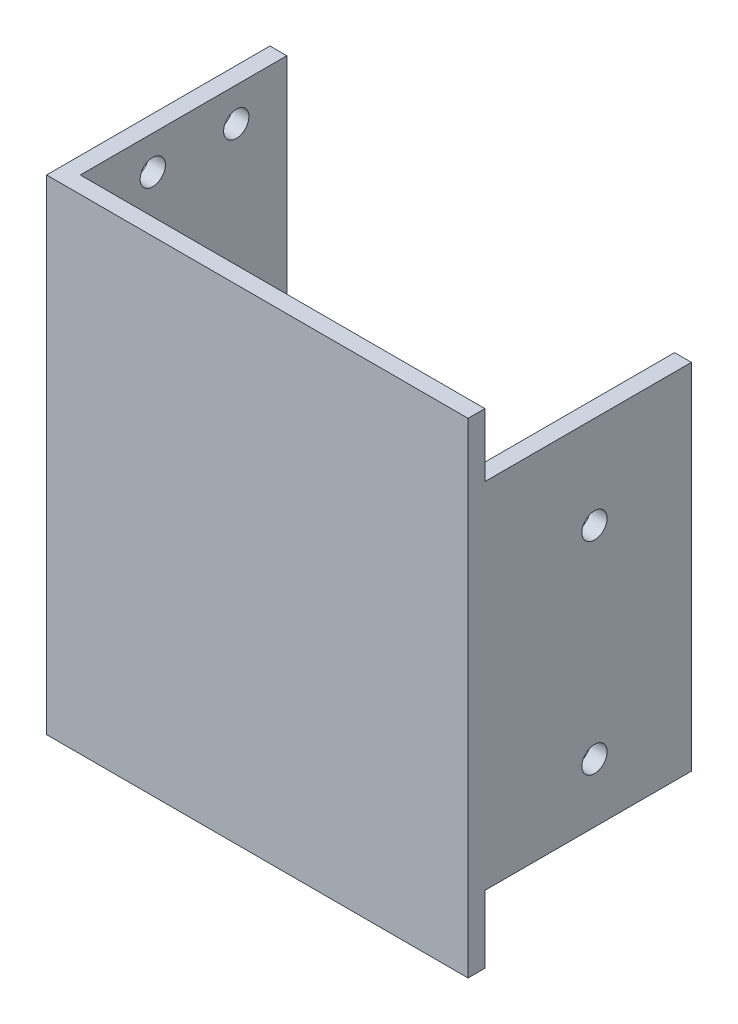
ISO-10303-21;
HEADER;
FILE_DESCRIPTION(('STEP AP214'),'2;1');
FILE_NAME('part.step','',(''),(''),'','','');
FILE_SCHEMA(('AUTOMOTIVE_DESIGN { 1 0 10303 214 1 1 1 1 }'));
ENDSEC;
DATA;
#1=APPLICATION_CONTEXT('core data for automotive mechanical design processes');
#2=APPLICATION_PROTOCOL_DEFINITION('international standard','automotive_design',2000,#1);
#3=PRODUCT_CONTEXT('',#1,'mechanical');
#4=PRODUCT('Part','Part','',(#3));
#5=PRODUCT_RELATED_PRODUCT_CATEGORY('part','',(#4));
#6=PRODUCT_DEFINITION_FORMATION('','',#4);
#7=PRODUCT_DEFINITION_CONTEXT('part definition',#1,'design');
#8=PRODUCT_DEFINITION('design','',#6,#7);
#9=PRODUCT_DEFINITION_SHAPE('','',#8);
#10=(LENGTH_UNIT() NAMED_UNIT(*) SI_UNIT(.MILLI.,.METRE.));
#11=(NAMED_UNIT(*) PLANE_ANGLE_UNIT() SI_UNIT($,.RADIAN.));
#12=(NAMED_UNIT(*) SI_UNIT($,.STERADIAN.) SOLID_ANGLE_UNIT());
#13=UNCERTAINTY_MEASURE_WITH_UNIT(LENGTH_MEASURE(1.E-05),#10,'distance_accuracy_value','');
#14=(GEOMETRIC_REPRESENTATION_CONTEXT(3) GLOBAL_UNCERTAINTY_ASSIGNED_CONTEXT((#13)) GLOBAL_UNIT_ASSIGNED_CONTEXT((#10,
#11,#12)) REPRESENTATION_CONTEXT('',''));
#15=CARTESIAN_POINT('',(0.,0.,0.));
#16=DIRECTION('',(0.,0.,1.));
#17=DIRECTION('',(1.,0.,0.));
#18=AXIS2_PLACEMENT_3D('',#15,#16,#17);
#19=CARTESIAN_POINT('',(0.,0.,-738.5));
#20=DIRECTION('',(0.,0.,-1.));
#21=DIRECTION('',(-1.,0.,0.));
#22=AXIS2_PLACEMENT_3D('',#19,#20,#21);
#23=PLANE('',#22);
#24=DIRECTION('',(0.,1.,0.));
#25=VECTOR('',#24,1.);
#26=CARTESIAN_POINT('',(23.,3.74999999999999,-738.5));
#27=LINE('',#26,#25);
#28=CARTESIAN_POINT('',(23.,-38.25,-738.5));
#29=VERTEX_POINT('',#28);
#30=CARTESIAN_POINT('',(23.,3.74999999999999,-738.5));
#31=VERTEX_POINT('',#30);
#32=EDGE_CURVE('E282',#29,#31,#27,.T.);
#33=ORIENTED_EDGE('',*,*,#32,.F.);
#34=DIRECTION('',(-1.,0.,0.));
#35=VECTOR('',#34,1.);
#36=CARTESIAN_POINT('',(25.,-38.25,-738.5));
#37=LINE('',#36,#35);
#38=CARTESIAN_POINT('',(25.,-38.25,-738.5));
#39=VERTEX_POINT('',#38);
#40=EDGE_CURVE('E234',#39,#29,#37,.T.);
#41=ORIENTED_EDGE('',*,*,#40,.F.);
#42=DIRECTION('',(0.,-1.,0.));
#43=VECTOR('',#42,1.);
#44=CARTESIAN_POINT('',(25.,11.25,-738.5));
#45=LINE('',#44,#43);
#46=CARTESIAN_POINT('',(25.,-46.25,-738.5));
#47=VERTEX_POINT('',#46);
#48=EDGE_CURVE('E153',#39,#47,#45,.T.);
#49=ORIENTED_EDGE('',*,*,#48,.T.);
#50=DIRECTION('',(-1.,0.,0.));
#51=VECTOR('',#50,1.);
#52=CARTESIAN_POINT('',(25.,-46.25,-738.5));
#53=LINE('',#52,#51);
#54=CARTESIAN_POINT('',(-23.,-46.25,-738.5));
#55=VERTEX_POINT('',#54);
#56=EDGE_CURVE('E189',#47,#55,#53,.T.);
#57=ORIENTED_EDGE('',*,*,#56,.T.);
#58=DIRECTION('',(0.,-1.,0.));
#59=VECTOR('',#58,1.);
#60=CARTESIAN_POINT('',(-23.,11.25,-738.5));
#61=LINE('',#60,#59);
#62=CARTESIAN_POINT('',(-23.,11.25,-738.5));
#63=VERTEX_POINT('',#62);
#64=EDGE_CURVE('E73',#63,#55,#61,.T.);
#65=ORIENTED_EDGE('',*,*,#64,.F.);
#66=DIRECTION('',(1.,0.,0.));
#67=VECTOR('',#66,1.);
#68=CARTESIAN_POINT('',(25.,11.25,-738.5));
#69=LINE('',#68,#67);
#70=CARTESIAN_POINT('',(25.,11.25,-738.5));
#71=VERTEX_POINT('',#70);
#72=EDGE_CURVE('E192',#63,#71,#69,.T.);
#73=ORIENTED_EDGE('',*,*,#72,.T.);
#74=CARTESIAN_POINT('',(25.,3.74999999999999,-738.5));
#75=VERTEX_POINT('',#74);
#76=EDGE_CURVE('E185',#71,#75,#45,.T.);
#77=ORIENTED_EDGE('',*,*,#76,.T.);
#78=DIRECTION('',(1.,0.,0.));
#79=VECTOR('',#78,1.);
#80=CARTESIAN_POINT('',(25.,3.74999999999999,-738.5));
#81=LINE('',#80,#79);
#82=EDGE_CURVE('E148',#31,#75,#81,.T.);
#83=ORIENTED_EDGE('',*,*,#82,.F.);
#84=EDGE_LOOP('',(#33,#41,#49,#57,#65,#73,#77,#83));
#85=FACE_BOUND('',#84,.T.);
#86=ADVANCED_FACE('F47',(#85),#23,.T.);
#87=CARTESIAN_POINT('',(25.,11.25,-738.5));
#88=DIRECTION('',(-1.,0.,0.));
#89=DIRECTION('',(0.,-1.,0.));
#90=AXIS2_PLACEMENT_3D('',#87,#88,#89);
#91=PLANE('',#90);
#92=CARTESIAN_POINT('',(25.,-7.25000000000001,-751.5));
#93=DIRECTION('',(1.,0.,0.));
#94=DIRECTION('',(0.,1.,0.));
#95=AXIS2_PLACEMENT_3D('',#92,#93,#94);
#96=CIRCLE('',#95,1.49999999999997);
#97=CARTESIAN_POINT('',(25.,-5.75000000000004,-751.5));
#98=VERTEX_POINT('',#97);
#99=EDGE_CURVE('E243',#98,#98,#96,.T.);
#100=ORIENTED_EDGE('',*,*,#99,.F.);
#101=EDGE_LOOP('',(#100));
#102=FACE_BOUND('',#101,.T.);
#103=CARTESIAN_POINT('',(25.,-31.25,-751.5));
#104=DIRECTION('',(1.,0.,0.));
#105=DIRECTION('',(0.,1.,0.));
#106=AXIS2_PLACEMENT_3D('',#103,#104,#105);
#107=CIRCLE('',#106,1.49999999999997);
#108=CARTESIAN_POINT('',(25.,-29.75,-751.5));
#109=VERTEX_POINT('',#108);
#110=EDGE_CURVE('E250',#109,#109,#107,.T.);
#111=ORIENTED_EDGE('',*,*,#110,.F.);
#112=EDGE_LOOP('',(#111));
#113=FACE_BOUND('',#112,.T.);
#114=DIRECTION('',(0.,-1.,0.));
#115=VECTOR('',#114,1.);
#116=CARTESIAN_POINT('',(25.,11.25,-736.5));
#117=LINE('',#116,#115);
#118=CARTESIAN_POINT('',(25.,11.25,-736.5));
#119=VERTEX_POINT('',#118);
#120=CARTESIAN_POINT('',(25.,-46.25,-736.5));
#121=VERTEX_POINT('',#120);
#122=EDGE_CURVE('E184',#119,#121,#117,.T.);
#123=ORIENTED_EDGE('',*,*,#122,.T.);
#124=DIRECTION('',(0.,0.,1.));
#125=VECTOR('',#124,1.);
#126=CARTESIAN_POINT('',(25.,-46.25,-738.5));
#127=LINE('',#126,#125);
#128=EDGE_CURVE('E11',#47,#121,#127,.T.);
#129=ORIENTED_EDGE('',*,*,#128,.F.);
#130=ORIENTED_EDGE('',*,*,#48,.F.);
#131=DIRECTION('',(0.,0.,1.));
#132=VECTOR('',#131,1.);
#133=CARTESIAN_POINT('',(25.,-38.25,-763.));
#134=LINE('',#133,#132);
#135=CARTESIAN_POINT('',(25.,-38.25,-763.));
#136=VERTEX_POINT('',#135);
#137=EDGE_CURVE('E131',#136,#39,#134,.T.);
#138=ORIENTED_EDGE('',*,*,#137,.F.);
#139=DIRECTION('',(0.,-1.,0.));
#140=VECTOR('',#139,1.);
#141=CARTESIAN_POINT('',(25.,3.74999999999999,-763.));
#142=LINE('',#141,#140);
#143=CARTESIAN_POINT('',(25.,3.74999999999999,-763.));
#144=VERTEX_POINT('',#143);
#145=EDGE_CURVE('E139',#144,#136,#142,.T.);
#146=ORIENTED_EDGE('',*,*,#145,.F.);
#147=DIRECTION('',(0.,0.,1.));
#148=VECTOR('',#147,1.);
#149=CARTESIAN_POINT('',(25.,3.74999999999999,-763.));
#150=LINE('',#149,#148);
#151=EDGE_CURVE('E279',#144,#75,#150,.T.);
#152=ORIENTED_EDGE('',*,*,#151,.T.);
#153=ORIENTED_EDGE('',*,*,#76,.F.);
#154=DIRECTION('',(0.,0.,1.));
#155=VECTOR('',#154,1.);
#156=CARTESIAN_POINT('',(25.,11.25,-738.5));
#157=LINE('',#156,#155);
#158=EDGE_CURVE('E195',#71,#119,#157,.T.);
#159=ORIENTED_EDGE('',*,*,#158,.T.);
#160=EDGE_LOOP('',(#123,#129,#130,#138,#146,#152,#153,#159));
#161=FACE_BOUND('',#160,.T.);
#162=ADVANCED_FACE('F49',(#102,#113,#161),#91,.F.);
#163=CARTESIAN_POINT('',(25.,-46.25,-738.5));
#164=DIRECTION('',(0.,1.,0.));
#165=DIRECTION('',(0.,0.,1.));
#166=AXIS2_PLACEMENT_3D('',#163,#164,#165);
#167=PLANE('',#166);
#168=DIRECTION('',(-1.,0.,0.));
#169=VECTOR('',#168,1.);
#170=CARTESIAN_POINT('',(25.,-46.25,-736.5));
#171=LINE('',#170,#169);
#172=CARTESIAN_POINT('',(-25.,-46.25,-736.5));
#173=VERTEX_POINT('',#172);
#174=EDGE_CURVE('E198',#121,#173,#171,.T.);
#175=ORIENTED_EDGE('',*,*,#174,.T.);
#176=DIRECTION('',(0.,0.,1.));
#177=VECTOR('',#176,1.);
#178=CARTESIAN_POINT('',(-25.,-46.25,-738.5));
#179=LINE('',#178,#177);
#180=CARTESIAN_POINT('',(-25.,-46.25,-763.));
#181=VERTEX_POINT('',#180);
#182=EDGE_CURVE('E57',#181,#173,#179,.T.);
#183=ORIENTED_EDGE('',*,*,#182,.F.);
#184=DIRECTION('',(-1.,0.,0.));
#185=VECTOR('',#184,1.);
#186=CARTESIAN_POINT('',(-25.,-46.25,-763.));
#187=LINE('',#186,#185);
#188=CARTESIAN_POINT('',(-23.,-46.25,-763.));
#189=VERTEX_POINT('',#188);
#190=EDGE_CURVE('E172',#189,#181,#187,.T.);
#191=ORIENTED_EDGE('',*,*,#190,.F.);
#192=DIRECTION('',(0.,0.,1.));
#193=VECTOR('',#192,1.);
#194=CARTESIAN_POINT('',(-23.,-46.25,-763.));
#195=LINE('',#194,#193);
#196=EDGE_CURVE('E175',#189,#55,#195,.T.);
#197=ORIENTED_EDGE('',*,*,#196,.T.);
#198=ORIENTED_EDGE('',*,*,#56,.F.);
#199=ORIENTED_EDGE('',*,*,#128,.T.);
#200=EDGE_LOOP('',(#175,#183,#191,#197,#198,#199));
#201=FACE_BOUND('',#200,.T.);
#202=ADVANCED_FACE('F303',(#201),#167,.F.);
#203=CARTESIAN_POINT('',(-25.,11.25,-738.5));
#204=DIRECTION('',(1.,0.,0.));
#205=DIRECTION('',(0.,1.,0.));
#206=AXIS2_PLACEMENT_3D('',#203,#204,#205);
#207=PLANE('',#206);
#208=CARTESIAN_POINT('',(-25.,-31.25,-752.05));
#209=DIRECTION('',(-1.,0.,0.));
#210=DIRECTION('',(0.,-1.,0.));
#211=AXIS2_PLACEMENT_3D('',#208,#209,#210);
#212=CIRCLE('',#211,1.49999999999997);
#213=CARTESIAN_POINT('',(-25.,-32.75,-752.05));
#214=VERTEX_POINT('',#213);
#215=EDGE_CURVE('E239',#214,#214,#212,.T.);
#216=ORIENTED_EDGE('',*,*,#215,.F.);
#217=EDGE_LOOP('',(#216));
#218=FACE_BOUND('',#217,.T.);
#219=CARTESIAN_POINT('',(-25.,-41.75,-757.));
#220=DIRECTION('',(-1.,0.,0.));
#221=DIRECTION('',(0.,-1.,0.));
#222=AXIS2_PLACEMENT_3D('',#219,#220,#221);
#223=CIRCLE('',#222,1.49999999999997);
#224=CARTESIAN_POINT('',(-25.,-43.25,-757.));
#225=VERTEX_POINT('',#224);
#226=EDGE_CURVE('E238',#225,#225,#223,.T.);
#227=ORIENTED_EDGE('',*,*,#226,.F.);
#228=EDGE_LOOP('',(#227));
#229=FACE_BOUND('',#228,.T.);
#230=CARTESIAN_POINT('',(-25.,-41.75,-747.1));
#231=DIRECTION('',(-1.,0.,0.));
#232=DIRECTION('',(0.,-1.,0.));
#233=AXIS2_PLACEMENT_3D('',#230,#231,#232);
#234=CIRCLE('',#233,1.49999999999997);
#235=CARTESIAN_POINT('',(-25.,-43.25,-747.1));
#236=VERTEX_POINT('',#235);
#237=EDGE_CURVE('E265',#236,#236,#234,.T.);
#238=ORIENTED_EDGE('',*,*,#237,.F.);
#239=EDGE_LOOP('',(#238));
#240=FACE_BOUND('',#239,.T.);
#241=CARTESIAN_POINT('',(-25.,7.25,-747.1));
#242=DIRECTION('',(-1.,0.,0.));
#243=DIRECTION('',(0.,-1.,0.));
#244=AXIS2_PLACEMENT_3D('',#241,#242,#243);
#245=CIRCLE('',#244,1.49999999999997);
#246=CARTESIAN_POINT('',(-25.,5.75000000000003,-747.1));
#247=VERTEX_POINT('',#246);
#248=EDGE_CURVE('E261',#247,#247,#245,.T.);
#249=ORIENTED_EDGE('',*,*,#248,.F.);
#250=EDGE_LOOP('',(#249));
#251=FACE_BOUND('',#250,.T.);
#252=CARTESIAN_POINT('',(-25.,7.24999999999999,-757.));
#253=DIRECTION('',(-1.,0.,0.));
#254=DIRECTION('',(0.,-1.,0.));
#255=AXIS2_PLACEMENT_3D('',#252,#253,#254);
#256=CIRCLE('',#255,1.49999999999997);
#257=CARTESIAN_POINT('',(-25.,5.75000000000003,-757.));
#258=VERTEX_POINT('',#257);
#259=EDGE_CURVE('E222',#258,#258,#256,.T.);
#260=ORIENTED_EDGE('',*,*,#259,.F.);
#261=EDGE_LOOP('',(#260));
#262=FACE_BOUND('',#261,.T.);
#263=DIRECTION('',(0.,1.,0.));
#264=VECTOR('',#263,1.);
#265=CARTESIAN_POINT('',(-25.,11.25,-736.5));
#266=LINE('',#265,#264);
#267=CARTESIAN_POINT('',(-25.,11.25,-736.5));
#268=VERTEX_POINT('',#267);
#269=EDGE_CURVE('E201',#173,#268,#266,.T.);
#270=ORIENTED_EDGE('',*,*,#269,.T.);
#271=DIRECTION('',(0.,0.,1.));
#272=VECTOR('',#271,1.);
#273=CARTESIAN_POINT('',(-25.,11.25,-738.5));
#274=LINE('',#273,#272);
#275=CARTESIAN_POINT('',(-25.,11.25,-763.));
#276=VERTEX_POINT('',#275);
#277=EDGE_CURVE('E210',#276,#268,#274,.T.);
#278=ORIENTED_EDGE('',*,*,#277,.F.);
#279=DIRECTION('',(0.,1.,0.));
#280=VECTOR('',#279,1.);
#281=CARTESIAN_POINT('',(-25.,11.25,-763.));
#282=LINE('',#281,#280);
#283=EDGE_CURVE('E158',#181,#276,#282,.T.);
#284=ORIENTED_EDGE('',*,*,#283,.F.);
#285=ORIENTED_EDGE('',*,*,#182,.T.);
#286=EDGE_LOOP('',(#270,#278,#284,#285));
#287=FACE_BOUND('',#286,.T.);
#288=ADVANCED_FACE('F314',(#218,#229,#240,#251,#262,#287),#207,.F.);
#289=CARTESIAN_POINT('',(25.,11.25,-738.5));
#290=DIRECTION('',(0.,-1.,0.));
#291=DIRECTION('',(0.,0.,-1.));
#292=AXIS2_PLACEMENT_3D('',#289,#290,#291);
#293=PLANE('',#292);
#294=DIRECTION('',(1.,0.,0.));
#295=VECTOR('',#294,1.);
#296=CARTESIAN_POINT('',(25.,11.25,-736.5));
#297=LINE('',#296,#295);
#298=EDGE_CURVE('E204',#268,#119,#297,.T.);
#299=ORIENTED_EDGE('',*,*,#298,.T.);
#300=ORIENTED_EDGE('',*,*,#158,.F.);
#301=ORIENTED_EDGE('',*,*,#72,.F.);
#302=DIRECTION('',(0.,0.,1.));
#303=VECTOR('',#302,1.);
#304=CARTESIAN_POINT('',(-23.,11.25,-763.));
#305=LINE('',#304,#303);
#306=CARTESIAN_POINT('',(-23.,11.25,-763.));
#307=VERTEX_POINT('',#306);
#308=EDGE_CURVE('E180',#307,#63,#305,.T.);
#309=ORIENTED_EDGE('',*,*,#308,.F.);
#310=DIRECTION('',(1.,0.,0.));
#311=VECTOR('',#310,1.);
#312=CARTESIAN_POINT('',(-25.,11.25,-763.));
#313=LINE('',#312,#311);
#314=EDGE_CURVE('E166',#276,#307,#313,.T.);
#315=ORIENTED_EDGE('',*,*,#314,.F.);
#316=ORIENTED_EDGE('',*,*,#277,.T.);
#317=EDGE_LOOP('',(#299,#300,#301,#309,#315,#316));
#318=FACE_BOUND('',#317,.T.);
#319=ADVANCED_FACE('F295',(#318),#293,.F.);
#320=CARTESIAN_POINT('',(0.,0.,-736.5));
#321=DIRECTION('',(0.,0.,-1.));
#322=DIRECTION('',(-1.,0.,0.));
#323=AXIS2_PLACEMENT_3D('',#320,#321,#322);
#324=PLANE('',#323);
#325=ORIENTED_EDGE('',*,*,#122,.F.);
#326=ORIENTED_EDGE('',*,*,#298,.F.);
#327=ORIENTED_EDGE('',*,*,#269,.F.);
#328=ORIENTED_EDGE('',*,*,#174,.F.);
#329=EDGE_LOOP('',(#325,#326,#327,#328));
#330=FACE_BOUND('',#329,.T.);
#331=ADVANCED_FACE('F299',(#330),#324,.F.);
#332=CARTESIAN_POINT('',(-23.,11.25,-763.));
#333=DIRECTION('',(-1.,0.,0.));
#334=DIRECTION('',(0.,-1.,0.));
#335=AXIS2_PLACEMENT_3D('',#332,#333,#334);
#336=PLANE('',#335);
#337=CARTESIAN_POINT('',(-23.,-31.25,-752.05));
#338=DIRECTION('',(-1.,0.,0.));
#339=DIRECTION('',(0.,-1.,0.));
#340=AXIS2_PLACEMENT_3D('',#337,#338,#339);
#341=CIRCLE('',#340,1.49999999999997);
#342=CARTESIAN_POINT('',(-23.,-32.75,-752.05));
#343=VERTEX_POINT('',#342);
#344=EDGE_CURVE('E235',#343,#343,#341,.T.);
#345=ORIENTED_EDGE('',*,*,#344,.T.);
#346=EDGE_LOOP('',(#345));
#347=FACE_BOUND('',#346,.T.);
#348=CARTESIAN_POINT('',(-23.,-41.75,-757.));
#349=DIRECTION('',(-1.,0.,0.));
#350=DIRECTION('',(0.,-1.,0.));
#351=AXIS2_PLACEMENT_3D('',#348,#349,#350);
#352=CIRCLE('',#351,1.49999999999997);
#353=CARTESIAN_POINT('',(-23.,-43.25,-757.));
#354=VERTEX_POINT('',#353);
#355=EDGE_CURVE('E230',#354,#354,#352,.T.);
#356=ORIENTED_EDGE('',*,*,#355,.T.);
#357=EDGE_LOOP('',(#356));
#358=FACE_BOUND('',#357,.T.);
#359=CARTESIAN_POINT('',(-23.,-41.75,-747.1));
#360=DIRECTION('',(-1.,0.,0.));
#361=DIRECTION('',(0.,-1.,0.));
#362=AXIS2_PLACEMENT_3D('',#359,#360,#361);
#363=CIRCLE('',#362,1.49999999999997);
#364=CARTESIAN_POINT('',(-23.,-43.25,-747.1));
#365=VERTEX_POINT('',#364);
#366=EDGE_CURVE('E226',#365,#365,#363,.T.);
#367=ORIENTED_EDGE('',*,*,#366,.T.);
#368=EDGE_LOOP('',(#367));
#369=FACE_BOUND('',#368,.T.);
#370=CARTESIAN_POINT('',(-23.,7.25,-747.1));
#371=DIRECTION('',(-1.,0.,0.));
#372=DIRECTION('',(0.,-1.,0.));
#373=AXIS2_PLACEMENT_3D('',#370,#371,#372);
#374=CIRCLE('',#373,1.49999999999997);
#375=CARTESIAN_POINT('',(-23.,5.75000000000003,-747.1));
#376=VERTEX_POINT('',#375);
#377=EDGE_CURVE('E221',#376,#376,#374,.T.);
#378=ORIENTED_EDGE('',*,*,#377,.T.);
#379=EDGE_LOOP('',(#378));
#380=FACE_BOUND('',#379,.T.);
#381=CARTESIAN_POINT('',(-23.,7.24999999999999,-757.));
#382=DIRECTION('',(-1.,0.,0.));
#383=DIRECTION('',(0.,-1.,0.));
#384=AXIS2_PLACEMENT_3D('',#381,#382,#383);
#385=CIRCLE('',#384,1.49999999999997);
#386=CARTESIAN_POINT('',(-23.,5.75000000000002,-757.));
#387=VERTEX_POINT('',#386);
#388=EDGE_CURVE('E217',#387,#387,#385,.T.);
#389=ORIENTED_EDGE('',*,*,#388,.T.);
#390=EDGE_LOOP('',(#389));
#391=FACE_BOUND('',#390,.T.);
#392=ORIENTED_EDGE('',*,*,#64,.T.);
#393=ORIENTED_EDGE('',*,*,#196,.F.);
#394=DIRECTION('',(0.,-1.,0.));
#395=VECTOR('',#394,1.);
#396=CARTESIAN_POINT('',(-23.,11.25,-763.));
#397=LINE('',#396,#395);
#398=EDGE_CURVE('E169',#307,#189,#397,.T.);
#399=ORIENTED_EDGE('',*,*,#398,.F.);
#400=ORIENTED_EDGE('',*,*,#308,.T.);
#401=EDGE_LOOP('',(#392,#393,#399,#400));
#402=FACE_BOUND('',#401,.T.);
#403=ADVANCED_FACE('F307',(#347,#358,#369,#380,#391,#402),#336,.F.);
#404=CARTESIAN_POINT('',(0.,0.,-763.));
#405=DIRECTION('',(0.,0.,1.));
#406=DIRECTION('',(1.,0.,0.));
#407=AXIS2_PLACEMENT_3D('',#404,#405,#406);
#408=PLANE('',#407);
#409=ORIENTED_EDGE('',*,*,#283,.T.);
#410=ORIENTED_EDGE('',*,*,#314,.T.);
#411=ORIENTED_EDGE('',*,*,#398,.T.);
#412=ORIENTED_EDGE('',*,*,#190,.T.);
#413=EDGE_LOOP('',(#409,#410,#411,#412));
#414=FACE_BOUND('',#413,.T.);
#415=ADVANCED_FACE('F312',(#414),#408,.F.);
#416=CARTESIAN_POINT('',(25.,-38.25,-763.));
#417=DIRECTION('',(0.,1.,0.));
#418=DIRECTION('',(0.,0.,1.));
#419=AXIS2_PLACEMENT_3D('',#416,#417,#418);
#420=PLANE('',#419);
#421=ORIENTED_EDGE('',*,*,#40,.T.);
#422=DIRECTION('',(0.,0.,1.));
#423=VECTOR('',#422,1.);
#424=CARTESIAN_POINT('',(23.,-38.25,-763.));
#425=LINE('',#424,#423);
#426=CARTESIAN_POINT('',(23.,-38.25,-763.));
#427=VERTEX_POINT('',#426);
#428=EDGE_CURVE('E134',#427,#29,#425,.T.);
#429=ORIENTED_EDGE('',*,*,#428,.F.);
#430=DIRECTION('',(-1.,0.,0.));
#431=VECTOR('',#430,1.);
#432=CARTESIAN_POINT('',(25.,-38.25,-763.));
#433=LINE('',#432,#431);
#434=EDGE_CURVE('E127',#136,#427,#433,.T.);
#435=ORIENTED_EDGE('',*,*,#434,.F.);
#436=ORIENTED_EDGE('',*,*,#137,.T.);
#437=EDGE_LOOP('',(#421,#429,#435,#436));
#438=FACE_BOUND('',#437,.T.);
#439=ADVANCED_FACE('F129',(#438),#420,.F.);
#440=CARTESIAN_POINT('',(23.,3.74999999999999,-763.));
#441=DIRECTION('',(1.,0.,0.));
#442=DIRECTION('',(0.,1.,0.));
#443=AXIS2_PLACEMENT_3D('',#440,#441,#442);
#444=PLANE('',#443);
#445=CARTESIAN_POINT('',(23.,-7.25000000000001,-751.5));
#446=DIRECTION('',(1.,0.,0.));
#447=DIRECTION('',(0.,1.,0.));
#448=AXIS2_PLACEMENT_3D('',#445,#446,#447);
#449=CIRCLE('',#448,1.49999999999997);
#450=CARTESIAN_POINT('',(23.,-5.75000000000004,-751.5));
#451=VERTEX_POINT('',#450);
#452=EDGE_CURVE('E51',#451,#451,#449,.T.);
#453=ORIENTED_EDGE('',*,*,#452,.T.);
#454=EDGE_LOOP('',(#453));
#455=FACE_BOUND('',#454,.T.);
#456=CARTESIAN_POINT('',(23.,-31.25,-751.5));
#457=DIRECTION('',(1.,0.,0.));
#458=DIRECTION('',(0.,1.,0.));
#459=AXIS2_PLACEMENT_3D('',#456,#457,#458);
#460=CIRCLE('',#459,1.49999999999997);
#461=CARTESIAN_POINT('',(23.,-29.75,-751.5));
#462=VERTEX_POINT('',#461);
#463=EDGE_CURVE('E240',#462,#462,#460,.T.);
#464=ORIENTED_EDGE('',*,*,#463,.T.);
#465=EDGE_LOOP('',(#464));
#466=FACE_BOUND('',#465,.T.);
#467=ORIENTED_EDGE('',*,*,#32,.T.);
#468=DIRECTION('',(0.,0.,1.));
#469=VECTOR('',#468,1.);
#470=CARTESIAN_POINT('',(23.,3.74999999999999,-763.));
#471=LINE('',#470,#469);
#472=CARTESIAN_POINT('',(23.,3.74999999999999,-763.));
#473=VERTEX_POINT('',#472);
#474=EDGE_CURVE('E65',#473,#31,#471,.T.);
#475=ORIENTED_EDGE('',*,*,#474,.F.);
#476=DIRECTION('',(0.,1.,0.));
#477=VECTOR('',#476,1.);
#478=CARTESIAN_POINT('',(23.,3.74999999999999,-763.));
#479=LINE('',#478,#477);
#480=EDGE_CURVE('E138',#427,#473,#479,.T.);
#481=ORIENTED_EDGE('',*,*,#480,.F.);
#482=ORIENTED_EDGE('',*,*,#428,.T.);
#483=EDGE_LOOP('',(#467,#475,#481,#482));
#484=FACE_BOUND('',#483,.T.);
#485=ADVANCED_FACE('F376',(#455,#466,#484),#444,.F.);
#486=CARTESIAN_POINT('',(25.,3.74999999999999,-763.));
#487=DIRECTION('',(0.,-1.,0.));
#488=DIRECTION('',(0.,0.,-1.));
#489=AXIS2_PLACEMENT_3D('',#486,#487,#488);
#490=PLANE('',#489);
#491=ORIENTED_EDGE('',*,*,#82,.T.);
#492=ORIENTED_EDGE('',*,*,#151,.F.);
#493=DIRECTION('',(1.,0.,0.));
#494=VECTOR('',#493,1.);
#495=CARTESIAN_POINT('',(25.,3.74999999999999,-763.));
#496=LINE('',#495,#494);
#497=EDGE_CURVE('E143',#473,#144,#496,.T.);
#498=ORIENTED_EDGE('',*,*,#497,.F.);
#499=ORIENTED_EDGE('',*,*,#474,.T.);
#500=EDGE_LOOP('',(#491,#492,#498,#499));
#501=FACE_BOUND('',#500,.T.);
#502=ADVANCED_FACE('F368',(#501),#490,.F.);
#503=CARTESIAN_POINT('',(0.,0.,-763.));
#504=DIRECTION('',(0.,0.,-1.));
#505=DIRECTION('',(-1.,0.,0.));
#506=AXIS2_PLACEMENT_3D('',#503,#504,#505);
#507=PLANE('',#506);
#508=ORIENTED_EDGE('',*,*,#145,.T.);
#509=ORIENTED_EDGE('',*,*,#434,.T.);
#510=ORIENTED_EDGE('',*,*,#480,.T.);
#511=ORIENTED_EDGE('',*,*,#497,.T.);
#512=EDGE_LOOP('',(#508,#509,#510,#511));
#513=FACE_BOUND('',#512,.T.);
#514=ADVANCED_FACE('F142',(#513),#507,.T.);
#515=CARTESIAN_POINT('',(-15.,7.24999999999999,-757.));
#516=DIRECTION('',(-1.,0.,0.));
#517=DIRECTION('',(0.,-1.,0.));
#518=AXIS2_PLACEMENT_3D('',#515,#516,#517);
#519=CYLINDRICAL_SURFACE('',#518,1.49999999999997);
#520=ORIENTED_EDGE('',*,*,#259,.T.);
#521=EDGE_LOOP('',(#520));
#522=FACE_BOUND('',#521,.T.);
#523=ORIENTED_EDGE('',*,*,#388,.F.);
#524=EDGE_LOOP('',(#523));
#525=FACE_BOUND('',#524,.T.);
#526=ADVANCED_FACE('F356',(#522,#525),#519,.F.);
#527=CARTESIAN_POINT('',(-15.,7.25,-747.1));
#528=DIRECTION('',(-1.,0.,0.));
#529=DIRECTION('',(0.,-1.,0.));
#530=AXIS2_PLACEMENT_3D('',#527,#528,#529);
#531=CYLINDRICAL_SURFACE('',#530,1.49999999999997);
#532=ORIENTED_EDGE('',*,*,#248,.T.);
#533=EDGE_LOOP('',(#532));
#534=FACE_BOUND('',#533,.T.);
#535=ORIENTED_EDGE('',*,*,#377,.F.);
#536=EDGE_LOOP('',(#535));
#537=FACE_BOUND('',#536,.T.);
#538=ADVANCED_FACE('F358',(#534,#537),#531,.F.);
#539=CARTESIAN_POINT('',(-15.,-41.75,-747.1));
#540=DIRECTION('',(-1.,0.,0.));
#541=DIRECTION('',(0.,-1.,0.));
#542=AXIS2_PLACEMENT_3D('',#539,#540,#541);
#543=CYLINDRICAL_SURFACE('',#542,1.49999999999997);
#544=ORIENTED_EDGE('',*,*,#237,.T.);
#545=EDGE_LOOP('',(#544));
#546=FACE_BOUND('',#545,.T.);
#547=ORIENTED_EDGE('',*,*,#366,.F.);
#548=EDGE_LOOP('',(#547));
#549=FACE_BOUND('',#548,.T.);
#550=ADVANCED_FACE('F365',(#546,#549),#543,.F.);
#551=CARTESIAN_POINT('',(-15.,-41.75,-757.));
#552=DIRECTION('',(-1.,0.,0.));
#553=DIRECTION('',(0.,-1.,0.));
#554=AXIS2_PLACEMENT_3D('',#551,#552,#553);
#555=CYLINDRICAL_SURFACE('',#554,1.49999999999997);
#556=ORIENTED_EDGE('',*,*,#226,.T.);
#557=EDGE_LOOP('',(#556));
#558=FACE_BOUND('',#557,.T.);
#559=ORIENTED_EDGE('',*,*,#355,.F.);
#560=EDGE_LOOP('',(#559));
#561=FACE_BOUND('',#560,.T.);
#562=ADVANCED_FACE('F371',(#558,#561),#555,.F.);
#563=CARTESIAN_POINT('',(-15.,-31.25,-752.05));
#564=DIRECTION('',(-1.,0.,0.));
#565=DIRECTION('',(0.,-1.,0.));
#566=AXIS2_PLACEMENT_3D('',#563,#564,#565);
#567=CYLINDRICAL_SURFACE('',#566,1.49999999999997);
#568=ORIENTED_EDGE('',*,*,#215,.T.);
#569=EDGE_LOOP('',(#568));
#570=FACE_BOUND('',#569,.T.);
#571=ORIENTED_EDGE('',*,*,#344,.F.);
#572=EDGE_LOOP('',(#571));
#573=FACE_BOUND('',#572,.T.);
#574=ADVANCED_FACE('F421',(#570,#573),#567,.F.);
#575=CARTESIAN_POINT('',(15.,-31.25,-751.5));
#576=DIRECTION('',(1.,0.,0.));
#577=DIRECTION('',(0.,1.,0.));
#578=AXIS2_PLACEMENT_3D('',#575,#576,#577);
#579=CYLINDRICAL_SURFACE('',#578,1.49999999999997);
#580=ORIENTED_EDGE('',*,*,#110,.T.);
#581=EDGE_LOOP('',(#580));
#582=FACE_BOUND('',#581,.T.);
#583=ORIENTED_EDGE('',*,*,#463,.F.);
#584=EDGE_LOOP('',(#583));
#585=FACE_BOUND('',#584,.T.);
#586=ADVANCED_FACE('F429',(#582,#585),#579,.F.);
#587=CARTESIAN_POINT('',(15.,-7.25,-751.5));
#588=DIRECTION('',(1.,0.,0.));
#589=DIRECTION('',(0.,1.,0.));
#590=AXIS2_PLACEMENT_3D('',#587,#588,#589);
#591=CYLINDRICAL_SURFACE('',#590,1.49999999999997);
#592=ORIENTED_EDGE('',*,*,#99,.T.);
#593=EDGE_LOOP('',(#592));
#594=FACE_BOUND('',#593,.T.);
#595=ORIENTED_EDGE('',*,*,#452,.F.);
#596=EDGE_LOOP('',(#595));
#597=FACE_BOUND('',#596,.T.);
#598=ADVANCED_FACE('F439',(#594,#597),#591,.F.);
#599=CLOSED_SHELL('',(#86,#162,#202,#288,#319,#331,#403,#415,#439,#485,#502,#514,#526,#538,#550,
#562,#574,#586,#598));
#600=MANIFOLD_SOLID_BREP('B2',#599);
#601=ADVANCED_BREP_SHAPE_REPRESENTATION('',(#18,#600),#14);
#602=SHAPE_DEFINITION_REPRESENTATION(#9,#601);
ENDSEC;
END-ISO-10303-21;
